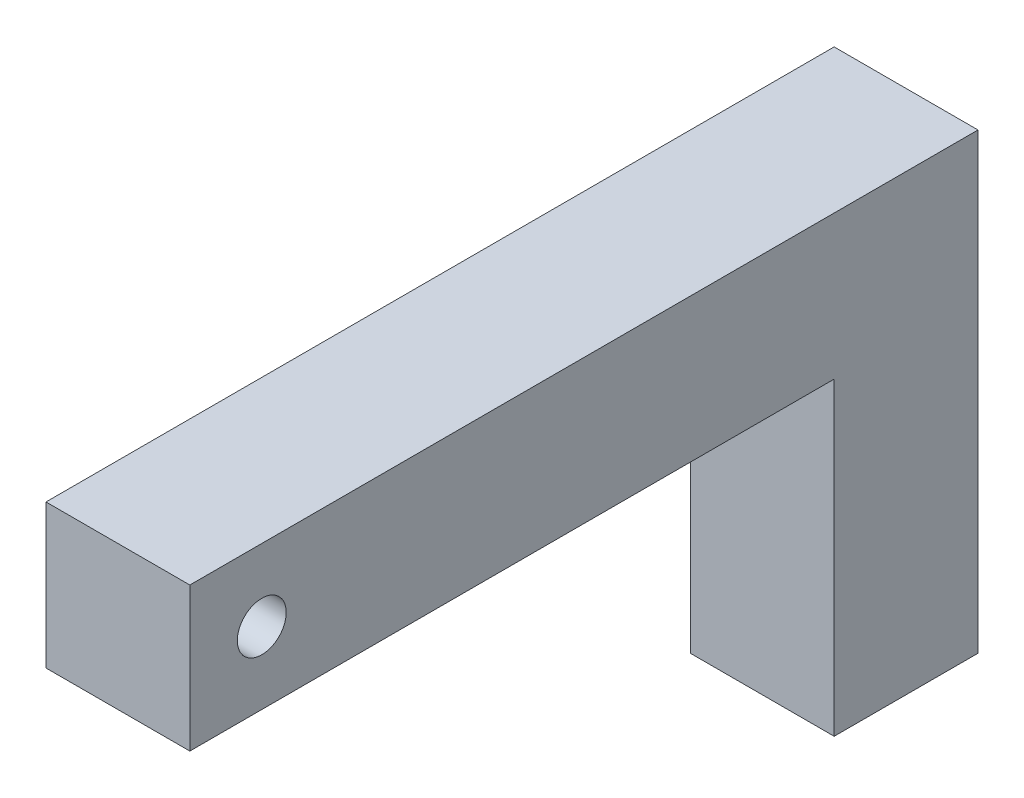
ISO-10303-21;
HEADER;
FILE_DESCRIPTION(('STEP AP214'),'2;1');
FILE_NAME('part.step','',(''),(''),'','','');
FILE_SCHEMA(('AUTOMOTIVE_DESIGN { 1 0 10303 214 1 1 1 1 }'));
ENDSEC;
DATA;
#1=APPLICATION_CONTEXT('core data for automotive mechanical design processes');
#2=APPLICATION_PROTOCOL_DEFINITION('international standard','automotive_design',2000,#1);
#3=PRODUCT_CONTEXT('',#1,'mechanical');
#4=PRODUCT('Part','Part','',(#3));
#5=PRODUCT_RELATED_PRODUCT_CATEGORY('part','',(#4));
#6=PRODUCT_DEFINITION_FORMATION('','',#4);
#7=PRODUCT_DEFINITION_CONTEXT('part definition',#1,'design');
#8=PRODUCT_DEFINITION('design','',#6,#7);
#9=PRODUCT_DEFINITION_SHAPE('','',#8);
#10=(LENGTH_UNIT() NAMED_UNIT(*) SI_UNIT(.MILLI.,.METRE.));
#11=(NAMED_UNIT(*) PLANE_ANGLE_UNIT() SI_UNIT($,.RADIAN.));
#12=(NAMED_UNIT(*) SI_UNIT($,.STERADIAN.) SOLID_ANGLE_UNIT());
#13=UNCERTAINTY_MEASURE_WITH_UNIT(LENGTH_MEASURE(1.E-05),#10,'distance_accuracy_value','');
#14=(GEOMETRIC_REPRESENTATION_CONTEXT(3) GLOBAL_UNCERTAINTY_ASSIGNED_CONTEXT((#13)) GLOBAL_UNIT_ASSIGNED_CONTEXT((#10,
#11,#12)) REPRESENTATION_CONTEXT('',''));
#15=CARTESIAN_POINT('',(0.,0.,0.));
#16=DIRECTION('',(0.,0.,1.));
#17=DIRECTION('',(1.,0.,0.));
#18=AXIS2_PLACEMENT_3D('',#15,#16,#17);
#19=CARTESIAN_POINT('',(10.,0.,0.));
#20=DIRECTION('',(-1.,0.,0.));
#21=DIRECTION('',(0.,0.,1.));
#22=AXIS2_PLACEMENT_3D('',#19,#20,#21);
#23=PLANE('',#22);
#24=DIRECTION('',(0.,0.,-1.));
#25=VECTOR('',#24,1.);
#26=CARTESIAN_POINT('',(10.,0.,0.));
#27=LINE('',#26,#25);
#28=CARTESIAN_POINT('',(10.,0.,0.));
#29=VERTEX_POINT('',#28);
#30=CARTESIAN_POINT('',(10.,0.,-44.7945205479452));
#31=VERTEX_POINT('',#30);
#32=EDGE_CURVE('E146',#29,#31,#27,.T.);
#33=ORIENTED_EDGE('',*,*,#32,.T.);
#34=DIRECTION('',(0.,-1.,0.));
#35=VECTOR('',#34,1.);
#36=CARTESIAN_POINT('',(10.,0.,-44.7945205479452));
#37=LINE('',#36,#35);
#38=CARTESIAN_POINT('',(10.,-21.5068493150685,-44.7945205479452));
#39=VERTEX_POINT('',#38);
#40=EDGE_CURVE('E94',#31,#39,#37,.T.);
#41=ORIENTED_EDGE('',*,*,#40,.T.);
#42=DIRECTION('',(0.,0.,-1.));
#43=VECTOR('',#42,1.);
#44=CARTESIAN_POINT('',(10.,-21.5068493150685,-44.7945205479452));
#45=LINE('',#44,#43);
#46=CARTESIAN_POINT('',(10.,-21.5068493150685,-54.7945205479452));
#47=VERTEX_POINT('',#46);
#48=EDGE_CURVE('E107',#39,#47,#45,.T.);
#49=ORIENTED_EDGE('',*,*,#48,.T.);
#50=DIRECTION('',(0.,1.,0.));
#51=VECTOR('',#50,1.);
#52=CARTESIAN_POINT('',(10.,10.,-54.7945205479452));
#53=LINE('',#52,#51);
#54=CARTESIAN_POINT('',(10.,10.,-54.7945205479452));
#55=VERTEX_POINT('',#54);
#56=EDGE_CURVE('E101',#47,#55,#53,.T.);
#57=ORIENTED_EDGE('',*,*,#56,.T.);
#58=DIRECTION('',(0.,0.,1.));
#59=VECTOR('',#58,1.);
#60=CARTESIAN_POINT('',(10.,10.,0.));
#61=LINE('',#60,#59);
#62=CARTESIAN_POINT('',(10.,10.,0.));
#63=VERTEX_POINT('',#62);
#64=EDGE_CURVE('E105',#55,#63,#61,.T.);
#65=ORIENTED_EDGE('',*,*,#64,.T.);
#66=DIRECTION('',(0.,-1.,0.));
#67=VECTOR('',#66,1.);
#68=CARTESIAN_POINT('',(10.,0.,0.));
#69=LINE('',#68,#67);
#70=EDGE_CURVE('E57',#63,#29,#69,.T.);
#71=ORIENTED_EDGE('',*,*,#70,.T.);
#72=EDGE_LOOP('',(#33,#41,#49,#57,#65,#71));
#73=FACE_BOUND('',#72,.T.);
#74=CARTESIAN_POINT('',(10.,5.,-5.));
#75=DIRECTION('',(1.,0.,0.));
#76=DIRECTION('',(0.,0.,-1.));
#77=AXIS2_PLACEMENT_3D('',#74,#75,#76);
#78=CIRCLE('',#77,1.7);
#79=CARTESIAN_POINT('',(10.,5.,-6.7));
#80=VERTEX_POINT('',#79);
#81=EDGE_CURVE('E134',#80,#80,#78,.T.);
#82=ORIENTED_EDGE('',*,*,#81,.F.);
#83=EDGE_LOOP('',(#82));
#84=FACE_BOUND('',#83,.T.);
#85=ADVANCED_FACE('F39',(#73,#84),#23,.F.);
#86=CARTESIAN_POINT('',(0.,0.,0.));
#87=DIRECTION('',(-1.,0.,0.));
#88=DIRECTION('',(0.,0.,1.));
#89=AXIS2_PLACEMENT_3D('',#86,#87,#88);
#90=PLANE('',#89);
#91=DIRECTION('',(0.,0.,-1.));
#92=VECTOR('',#91,1.);
#93=CARTESIAN_POINT('',(0.,0.,0.));
#94=LINE('',#93,#92);
#95=CARTESIAN_POINT('',(0.,0.,0.));
#96=VERTEX_POINT('',#95);
#97=CARTESIAN_POINT('',(0.,0.,-44.7945205479452));
#98=VERTEX_POINT('',#97);
#99=EDGE_CURVE('E129',#96,#98,#94,.T.);
#100=ORIENTED_EDGE('',*,*,#99,.F.);
#101=DIRECTION('',(0.,-1.,0.));
#102=VECTOR('',#101,1.);
#103=CARTESIAN_POINT('',(0.,0.,0.));
#104=LINE('',#103,#102);
#105=CARTESIAN_POINT('',(0.,10.,0.));
#106=VERTEX_POINT('',#105);
#107=EDGE_CURVE('E86',#106,#96,#104,.T.);
#108=ORIENTED_EDGE('',*,*,#107,.F.);
#109=DIRECTION('',(0.,0.,1.));
#110=VECTOR('',#109,1.);
#111=CARTESIAN_POINT('',(0.,10.,0.));
#112=LINE('',#111,#110);
#113=CARTESIAN_POINT('',(0.,10.,-54.7945205479452));
#114=VERTEX_POINT('',#113);
#115=EDGE_CURVE('E80',#114,#106,#112,.T.);
#116=ORIENTED_EDGE('',*,*,#115,.F.);
#117=DIRECTION('',(0.,1.,0.));
#118=VECTOR('',#117,1.);
#119=CARTESIAN_POINT('',(0.,10.,-54.7945205479452));
#120=LINE('',#119,#118);
#121=CARTESIAN_POINT('',(0.,-21.5068493150685,-54.7945205479452));
#122=VERTEX_POINT('',#121);
#123=EDGE_CURVE('E116',#122,#114,#120,.T.);
#124=ORIENTED_EDGE('',*,*,#123,.F.);
#125=DIRECTION('',(0.,0.,-1.));
#126=VECTOR('',#125,1.);
#127=CARTESIAN_POINT('',(0.,-21.5068493150685,-44.7945205479452));
#128=LINE('',#127,#126);
#129=CARTESIAN_POINT('',(0.,-21.5068493150685,-44.7945205479452));
#130=VERTEX_POINT('',#129);
#131=EDGE_CURVE('E137',#130,#122,#128,.T.);
#132=ORIENTED_EDGE('',*,*,#131,.F.);
#133=DIRECTION('',(0.,-1.,0.));
#134=VECTOR('',#133,1.);
#135=CARTESIAN_POINT('',(0.,0.,-44.7945205479452));
#136=LINE('',#135,#134);
#137=EDGE_CURVE('E133',#98,#130,#136,.T.);
#138=ORIENTED_EDGE('',*,*,#137,.F.);
#139=EDGE_LOOP('',(#100,#108,#116,#124,#132,#138));
#140=FACE_BOUND('',#139,.T.);
#141=CARTESIAN_POINT('',(0.,5.,-5.));
#142=DIRECTION('',(1.,0.,0.));
#143=DIRECTION('',(0.,0.,-1.));
#144=AXIS2_PLACEMENT_3D('',#141,#142,#143);
#145=CIRCLE('',#144,1.7);
#146=CARTESIAN_POINT('',(0.,5.,-6.7));
#147=VERTEX_POINT('',#146);
#148=EDGE_CURVE('E243',#147,#147,#145,.T.);
#149=ORIENTED_EDGE('',*,*,#148,.T.);
#150=EDGE_LOOP('',(#149));
#151=FACE_BOUND('',#150,.T.);
#152=ADVANCED_FACE('F159',(#140,#151),#90,.T.);
#153=CARTESIAN_POINT('',(10.,0.,0.));
#154=DIRECTION('',(0.,1.,0.));
#155=DIRECTION('',(0.,0.,1.));
#156=AXIS2_PLACEMENT_3D('',#153,#154,#155);
#157=PLANE('',#156);
#158=ORIENTED_EDGE('',*,*,#99,.T.);
#159=DIRECTION('',(-1.,0.,0.));
#160=VECTOR('',#159,1.);
#161=CARTESIAN_POINT('',(10.,0.,-44.7945205479452));
#162=LINE('',#161,#160);
#163=EDGE_CURVE('E11',#31,#98,#162,.T.);
#164=ORIENTED_EDGE('',*,*,#163,.F.);
#165=ORIENTED_EDGE('',*,*,#32,.F.);
#166=DIRECTION('',(-1.,0.,0.));
#167=VECTOR('',#166,1.);
#168=CARTESIAN_POINT('',(10.,0.,0.));
#169=LINE('',#168,#167);
#170=EDGE_CURVE('E125',#29,#96,#169,.T.);
#171=ORIENTED_EDGE('',*,*,#170,.T.);
#172=EDGE_LOOP('',(#158,#164,#165,#171));
#173=FACE_BOUND('',#172,.T.);
#174=ADVANCED_FACE('F41',(#173),#157,.F.);
#175=CARTESIAN_POINT('',(10.,0.,-44.7945205479452));
#176=DIRECTION('',(0.,0.,-1.));
#177=DIRECTION('',(-1.,0.,0.));
#178=AXIS2_PLACEMENT_3D('',#175,#176,#177);
#179=PLANE('',#178);
#180=ORIENTED_EDGE('',*,*,#137,.T.);
#181=DIRECTION('',(-1.,0.,0.));
#182=VECTOR('',#181,1.);
#183=CARTESIAN_POINT('',(10.,-21.5068493150685,-44.7945205479452));
#184=LINE('',#183,#182);
#185=EDGE_CURVE('E49',#39,#130,#184,.T.);
#186=ORIENTED_EDGE('',*,*,#185,.F.);
#187=ORIENTED_EDGE('',*,*,#40,.F.);
#188=ORIENTED_EDGE('',*,*,#163,.T.);
#189=EDGE_LOOP('',(#180,#186,#187,#188));
#190=FACE_BOUND('',#189,.T.);
#191=ADVANCED_FACE('F184',(#190),#179,.F.);
#192=CARTESIAN_POINT('',(10.,-21.5068493150685,-44.7945205479452));
#193=DIRECTION('',(0.,1.,0.));
#194=DIRECTION('',(0.,0.,1.));
#195=AXIS2_PLACEMENT_3D('',#192,#193,#194);
#196=PLANE('',#195);
#197=ORIENTED_EDGE('',*,*,#131,.T.);
#198=DIRECTION('',(-1.,0.,0.));
#199=VECTOR('',#198,1.);
#200=CARTESIAN_POINT('',(10.,-21.5068493150685,-54.7945205479452));
#201=LINE('',#200,#199);
#202=EDGE_CURVE('E118',#47,#122,#201,.T.);
#203=ORIENTED_EDGE('',*,*,#202,.F.);
#204=ORIENTED_EDGE('',*,*,#48,.F.);
#205=ORIENTED_EDGE('',*,*,#185,.T.);
#206=EDGE_LOOP('',(#197,#203,#204,#205));
#207=FACE_BOUND('',#206,.T.);
#208=ADVANCED_FACE('F156',(#207),#196,.F.);
#209=CARTESIAN_POINT('',(10.,10.,-54.7945205479452));
#210=DIRECTION('',(0.,0.,1.));
#211=DIRECTION('',(1.,0.,0.));
#212=AXIS2_PLACEMENT_3D('',#209,#210,#211);
#213=PLANE('',#212);
#214=ORIENTED_EDGE('',*,*,#123,.T.);
#215=DIRECTION('',(-1.,0.,0.));
#216=VECTOR('',#215,1.);
#217=CARTESIAN_POINT('',(10.,10.,-54.7945205479452));
#218=LINE('',#217,#216);
#219=EDGE_CURVE('E113',#55,#114,#218,.T.);
#220=ORIENTED_EDGE('',*,*,#219,.F.);
#221=ORIENTED_EDGE('',*,*,#56,.F.);
#222=ORIENTED_EDGE('',*,*,#202,.T.);
#223=EDGE_LOOP('',(#214,#220,#221,#222));
#224=FACE_BOUND('',#223,.T.);
#225=ADVANCED_FACE('F114',(#224),#213,.F.);
#226=CARTESIAN_POINT('',(10.,10.,0.));
#227=DIRECTION('',(0.,-1.,0.));
#228=DIRECTION('',(0.,0.,-1.));
#229=AXIS2_PLACEMENT_3D('',#226,#227,#228);
#230=PLANE('',#229);
#231=ORIENTED_EDGE('',*,*,#115,.T.);
#232=DIRECTION('',(-1.,0.,0.));
#233=VECTOR('',#232,1.);
#234=CARTESIAN_POINT('',(10.,10.,0.));
#235=LINE('',#234,#233);
#236=EDGE_CURVE('E119',#63,#106,#235,.T.);
#237=ORIENTED_EDGE('',*,*,#236,.F.);
#238=ORIENTED_EDGE('',*,*,#64,.F.);
#239=ORIENTED_EDGE('',*,*,#219,.T.);
#240=EDGE_LOOP('',(#231,#237,#238,#239));
#241=FACE_BOUND('',#240,.T.);
#242=ADVANCED_FACE('F121',(#241),#230,.F.);
#243=CARTESIAN_POINT('',(10.,0.,0.));
#244=DIRECTION('',(0.,0.,-1.));
#245=DIRECTION('',(-1.,0.,0.));
#246=AXIS2_PLACEMENT_3D('',#243,#244,#245);
#247=PLANE('',#246);
#248=ORIENTED_EDGE('',*,*,#107,.T.);
#249=ORIENTED_EDGE('',*,*,#170,.F.);
#250=ORIENTED_EDGE('',*,*,#70,.F.);
#251=ORIENTED_EDGE('',*,*,#236,.T.);
#252=EDGE_LOOP('',(#248,#249,#250,#251));
#253=FACE_BOUND('',#252,.T.);
#254=ADVANCED_FACE('F164',(#253),#247,.F.);
#255=CARTESIAN_POINT('',(10.,5.,-5.));
#256=DIRECTION('',(-1.,0.,0.));
#257=DIRECTION('',(0.,0.,1.));
#258=AXIS2_PLACEMENT_3D('',#255,#256,#257);
#259=CYLINDRICAL_SURFACE('',#258,1.7);
#260=ORIENTED_EDGE('',*,*,#81,.T.);
#261=EDGE_LOOP('',(#260));
#262=FACE_BOUND('',#261,.T.);
#263=ORIENTED_EDGE('',*,*,#148,.F.);
#264=EDGE_LOOP('',(#263));
#265=FACE_BOUND('',#264,.T.);
#266=ADVANCED_FACE('F166',(#262,#265),#259,.F.);
#267=CLOSED_SHELL('',(#85,#152,#174,#191,#208,#225,#242,#254,#266));
#268=MANIFOLD_SOLID_BREP('B2',#267);
#269=ADVANCED_BREP_SHAPE_REPRESENTATION('',(#18,#268),#14);
#270=SHAPE_DEFINITION_REPRESENTATION(#9,#269);
ENDSEC;
END-ISO-10303-21;
